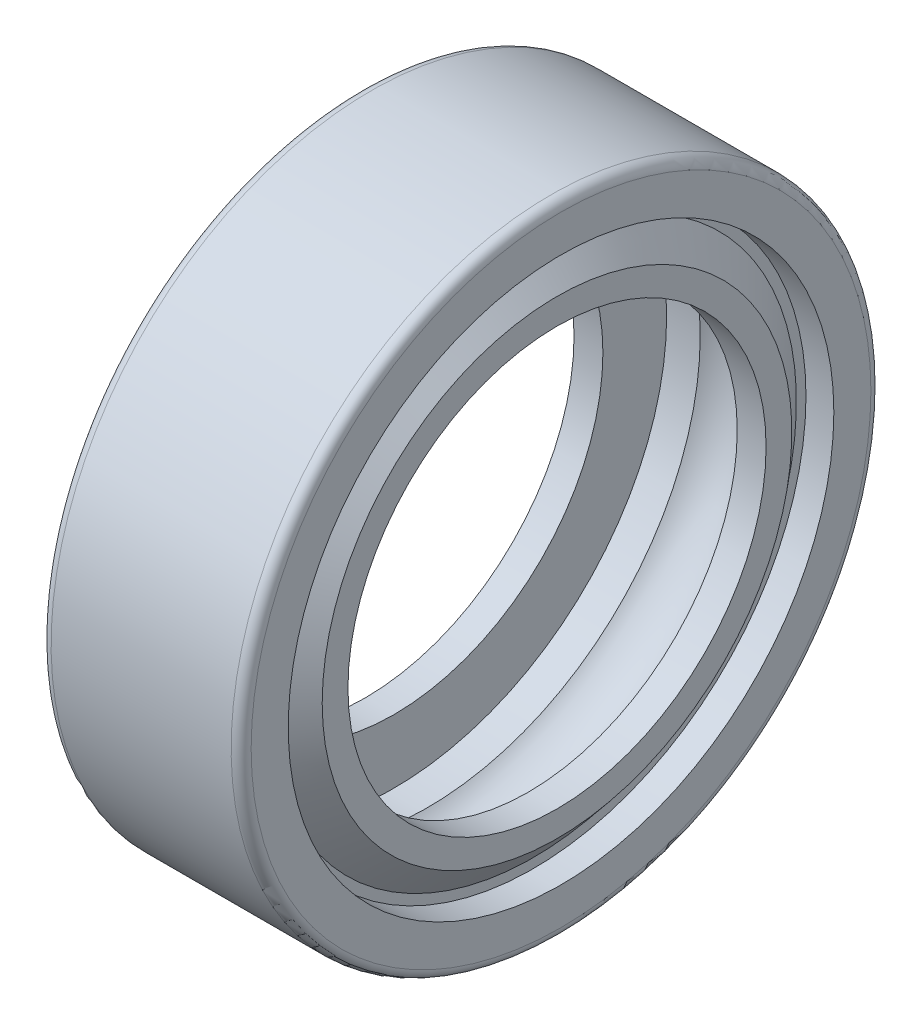
ISO-10303-21;
HEADER;
FILE_DESCRIPTION(('STEP AP214'),'2;1');
FILE_NAME('part.step','',(''),(''),'','','');
FILE_SCHEMA(('AUTOMOTIVE_DESIGN { 1 0 10303 214 1 1 1 1 }'));
ENDSEC;
DATA;
#1=APPLICATION_CONTEXT('core data for automotive mechanical design processes');
#2=APPLICATION_PROTOCOL_DEFINITION('international standard','automotive_design',2000,#1);
#3=PRODUCT_CONTEXT('',#1,'mechanical');
#4=PRODUCT('Part','Part','',(#3));
#5=PRODUCT_RELATED_PRODUCT_CATEGORY('part','',(#4));
#6=PRODUCT_DEFINITION_FORMATION('','',#4);
#7=PRODUCT_DEFINITION_CONTEXT('part definition',#1,'design');
#8=PRODUCT_DEFINITION('design','',#6,#7);
#9=PRODUCT_DEFINITION_SHAPE('','',#8);
#10=(LENGTH_UNIT() NAMED_UNIT(*) SI_UNIT(.MILLI.,.METRE.));
#11=(NAMED_UNIT(*) PLANE_ANGLE_UNIT() SI_UNIT($,.RADIAN.));
#12=(NAMED_UNIT(*) SI_UNIT($,.STERADIAN.) SOLID_ANGLE_UNIT());
#13=UNCERTAINTY_MEASURE_WITH_UNIT(LENGTH_MEASURE(1.E-05),#10,'distance_accuracy_value','');
#14=(GEOMETRIC_REPRESENTATION_CONTEXT(3) GLOBAL_UNCERTAINTY_ASSIGNED_CONTEXT((#13)) GLOBAL_UNIT_ASSIGNED_CONTEXT((#10,
#11,#12)) REPRESENTATION_CONTEXT('',''));
#15=CARTESIAN_POINT('',(0.,0.,0.));
#16=DIRECTION('',(0.,0.,1.));
#17=DIRECTION('',(1.,0.,0.));
#18=AXIS2_PLACEMENT_3D('',#15,#16,#17);
#19=CARTESIAN_POINT('',(0.,0.,0.));
#20=DIRECTION('',(1.,0.,0.));
#21=DIRECTION('',(0.,-1.,0.));
#22=AXIS2_PLACEMENT_3D('',#19,#20,#21);
#23=TOROIDAL_SURFACE('',#22,6.00075,1.175893);
#24=CARTESIAN_POINT('',(-0.839755569912454,0.,0.));
#25=DIRECTION('',(1.,0.,0.));
#26=DIRECTION('',(0.,0.,-1.));
#27=AXIS2_PLACEMENT_3D('',#24,#25,#26);
#28=CIRCLE('',#27,6.8238751);
#29=CARTESIAN_POINT('',(-0.839755569912454,0.,-6.8238751));
#30=VERTEX_POINT('',#29);
#31=EDGE_CURVE('E317',#30,#30,#28,.F.);
#32=ORIENTED_EDGE('',*,*,#31,.T.);
#33=EDGE_LOOP('',(#32));
#34=FACE_BOUND('',#33,.T.);
#35=CARTESIAN_POINT('',(0.839755569912453,0.,0.));
#36=DIRECTION('',(1.,0.,0.));
#37=DIRECTION('',(0.,0.,-1.));
#38=AXIS2_PLACEMENT_3D('',#35,#36,#37);
#39=CIRCLE('',#38,6.8238751);
#40=CARTESIAN_POINT('',(0.839755569912453,0.,-6.8238751));
#41=VERTEX_POINT('',#40);
#42=EDGE_CURVE('E320',#41,#41,#39,.T.);
#43=ORIENTED_EDGE('',*,*,#42,.T.);
#44=EDGE_LOOP('',(#43));
#45=FACE_BOUND('',#44,.T.);
#46=ADVANCED_FACE('F16',(#34,#45),#23,.F.);
#47=CARTESIAN_POINT('',(-2.75209,0.,0.));
#48=DIRECTION('',(1.,0.,0.));
#49=DIRECTION('',(0.,0.,-1.));
#50=AXIS2_PLACEMENT_3D('',#47,#48,#49);
#51=CYLINDRICAL_SURFACE('',#50,6.8238751);
#52=ORIENTED_EDGE('',*,*,#42,.F.);
#53=EDGE_LOOP('',(#52));
#54=FACE_BOUND('',#53,.T.);
#55=CARTESIAN_POINT('',(1.67997454728306,0.,0.));
#56=DIRECTION('',(1.,0.,0.));
#57=DIRECTION('',(0.,0.,-1.));
#58=AXIS2_PLACEMENT_3D('',#55,#56,#57);
#59=CIRCLE('',#58,6.8238751);
#60=CARTESIAN_POINT('',(1.67997454728306,0.,-6.8238751));
#61=VERTEX_POINT('',#60);
#62=EDGE_CURVE('E322',#61,#61,#59,.T.);
#63=ORIENTED_EDGE('',*,*,#62,.T.);
#64=EDGE_LOOP('',(#63));
#65=FACE_BOUND('',#64,.T.);
#66=ADVANCED_FACE('F291',(#54,#65),#51,.F.);
#67=CARTESIAN_POINT('',(-2.75209,0.,0.));
#68=DIRECTION('',(1.,0.,0.));
#69=DIRECTION('',(0.,0.,-1.));
#70=AXIS2_PLACEMENT_3D('',#67,#68,#69);
#71=CYLINDRICAL_SURFACE('',#70,6.8238751);
#72=ORIENTED_EDGE('',*,*,#31,.F.);
#73=EDGE_LOOP('',(#72));
#74=FACE_BOUND('',#73,.T.);
#75=CARTESIAN_POINT('',(-1.67997454728306,0.,0.));
#76=DIRECTION('',(1.,0.,0.));
#77=DIRECTION('',(0.,0.,-1.));
#78=AXIS2_PLACEMENT_3D('',#75,#76,#77);
#79=CIRCLE('',#78,6.8238751);
#80=CARTESIAN_POINT('',(-1.67997454728306,0.,-6.8238751));
#81=VERTEX_POINT('',#80);
#82=EDGE_CURVE('E362',#81,#81,#79,.T.);
#83=ORIENTED_EDGE('',*,*,#82,.F.);
#84=EDGE_LOOP('',(#83));
#85=FACE_BOUND('',#84,.T.);
#86=ADVANCED_FACE('F281',(#74,#85),#71,.F.);
#87=CARTESIAN_POINT('',(1.67997454728306,0.,0.));
#88=DIRECTION('',(1.,0.,0.));
#89=DIRECTION('',(0.,0.,-1.));
#90=AXIS2_PLACEMENT_3D('',#87,#88,#89);
#91=PLANE('',#90);
#92=ORIENTED_EDGE('',*,*,#62,.F.);
#93=EDGE_LOOP('',(#92));
#94=FACE_BOUND('',#93,.T.);
#95=CARTESIAN_POINT('',(1.67997454728306,0.,0.));
#96=DIRECTION('',(1.,0.,0.));
#97=DIRECTION('',(0.,0.,-1.));
#98=AXIS2_PLACEMENT_3D('',#95,#96,#97);
#99=CIRCLE('',#98,5.229401149);
#100=CARTESIAN_POINT('',(1.67997454728306,0.,-5.229401149));
#101=VERTEX_POINT('',#100);
#102=EDGE_CURVE('E359',#101,#101,#99,.T.);
#103=ORIENTED_EDGE('',*,*,#102,.T.);
#104=EDGE_LOOP('',(#103));
#105=FACE_BOUND('',#104,.T.);
#106=ADVANCED_FACE('F271',(#94,#105),#91,.F.);
#107=CARTESIAN_POINT('',(-1.67997454728306,0.,0.));
#108=DIRECTION('',(1.,0.,0.));
#109=DIRECTION('',(0.,0.,-1.));
#110=AXIS2_PLACEMENT_3D('',#107,#108,#109);
#111=PLANE('',#110);
#112=ORIENTED_EDGE('',*,*,#82,.T.);
#113=EDGE_LOOP('',(#112));
#114=FACE_BOUND('',#113,.T.);
#115=CARTESIAN_POINT('',(-1.67997454728306,0.,0.));
#116=DIRECTION('',(1.,0.,0.));
#117=DIRECTION('',(0.,0.,-1.));
#118=AXIS2_PLACEMENT_3D('',#115,#116,#117);
#119=CIRCLE('',#118,5.229401149);
#120=CARTESIAN_POINT('',(-1.67997454728306,0.,-5.229401149));
#121=VERTEX_POINT('',#120);
#122=EDGE_CURVE('E356',#121,#121,#119,.F.);
#123=ORIENTED_EDGE('',*,*,#122,.T.);
#124=EDGE_LOOP('',(#123));
#125=FACE_BOUND('',#124,.T.);
#126=ADVANCED_FACE('F261',(#114,#125),#111,.T.);
#127=CARTESIAN_POINT('',(-2.6420064,0.,0.));
#128=DIRECTION('',(1.,0.,0.));
#129=DIRECTION('',(0.,0.,-1.));
#130=AXIS2_PLACEMENT_3D('',#127,#128,#129);
#131=CYLINDRICAL_SURFACE('',#130,5.229401149);
#132=CARTESIAN_POINT('',(2.401824,0.,0.));
#133=DIRECTION('',(1.,0.,0.));
#134=DIRECTION('',(0.,0.,-1.));
#135=AXIS2_PLACEMENT_3D('',#132,#133,#134);
#136=CIRCLE('',#135,5.229401149);
#137=CARTESIAN_POINT('',(2.401824,0.,-5.229401149));
#138=VERTEX_POINT('',#137);
#139=EDGE_CURVE('E353',#138,#138,#136,.F.);
#140=ORIENTED_EDGE('',*,*,#139,.F.);
#141=EDGE_LOOP('',(#140));
#142=FACE_BOUND('',#141,.T.);
#143=ORIENTED_EDGE('',*,*,#102,.F.);
#144=EDGE_LOOP('',(#143));
#145=FACE_BOUND('',#144,.T.);
#146=ADVANCED_FACE('F251',(#142,#145),#131,.F.);
#147=CARTESIAN_POINT('',(-2.6420064,0.,0.));
#148=DIRECTION('',(1.,0.,0.));
#149=DIRECTION('',(0.,0.,-1.));
#150=AXIS2_PLACEMENT_3D('',#147,#148,#149);
#151=CYLINDRICAL_SURFACE('',#150,5.229401149);
#152=ORIENTED_EDGE('',*,*,#122,.F.);
#153=EDGE_LOOP('',(#152));
#154=FACE_BOUND('',#153,.T.);
#155=CARTESIAN_POINT('',(-2.401824,0.,0.));
#156=DIRECTION('',(1.,0.,0.));
#157=DIRECTION('',(0.,0.,-1.));
#158=AXIS2_PLACEMENT_3D('',#155,#156,#157);
#159=CIRCLE('',#158,5.229401149);
#160=CARTESIAN_POINT('',(-2.401824,0.,-5.229401149));
#161=VERTEX_POINT('',#160);
#162=EDGE_CURVE('E350',#161,#161,#159,.F.);
#163=ORIENTED_EDGE('',*,*,#162,.T.);
#164=EDGE_LOOP('',(#163));
#165=FACE_BOUND('',#164,.T.);
#166=ADVANCED_FACE('F241',(#154,#165),#151,.F.);
#167=CARTESIAN_POINT('',(2.401824,0.,0.));
#168=DIRECTION('',(1.,0.,0.));
#169=DIRECTION('',(0.,0.,-1.));
#170=AXIS2_PLACEMENT_3D('',#167,#168,#169);
#171=PLANE('',#170);
#172=CARTESIAN_POINT('',(2.40182399991697,0.,0.));
#173=DIRECTION('',(-1.,0.,0.));
#174=DIRECTION('',(0.,0.,1.));
#175=AXIS2_PLACEMENT_3D('',#172,#173,#174);
#176=CIRCLE('',#175,5.87385520856287);
#177=CARTESIAN_POINT('',(2.40182399991697,0.,5.87385520856287));
#178=VERTEX_POINT('',#177);
#179=EDGE_CURVE('E347',#178,#178,#176,.T.);
#180=ORIENTED_EDGE('',*,*,#179,.F.);
#181=EDGE_LOOP('',(#180));
#182=FACE_BOUND('',#181,.T.);
#183=ORIENTED_EDGE('',*,*,#139,.T.);
#184=EDGE_LOOP('',(#183));
#185=FACE_BOUND('',#184,.T.);
#186=ADVANCED_FACE('F230',(#182,#185),#171,.T.);
#187=CARTESIAN_POINT('',(-2.401824,0.,0.));
#188=DIRECTION('',(1.,0.,0.));
#189=DIRECTION('',(0.,0.,-1.));
#190=AXIS2_PLACEMENT_3D('',#187,#188,#189);
#191=PLANE('',#190);
#192=CARTESIAN_POINT('',(-2.40182399991697,0.,0.));
#193=DIRECTION('',(1.,0.,0.));
#194=DIRECTION('',(0.,0.,-1.));
#195=AXIS2_PLACEMENT_3D('',#192,#193,#194);
#196=CIRCLE('',#195,5.87385520856287);
#197=CARTESIAN_POINT('',(-2.40182399991697,0.,-5.87385520856287));
#198=VERTEX_POINT('',#197);
#199=EDGE_CURVE('E344',#198,#198,#196,.T.);
#200=ORIENTED_EDGE('',*,*,#199,.F.);
#201=EDGE_LOOP('',(#200));
#202=FACE_BOUND('',#201,.T.);
#203=ORIENTED_EDGE('',*,*,#162,.F.);
#204=EDGE_LOOP('',(#203));
#205=FACE_BOUND('',#204,.T.);
#206=ADVANCED_FACE('F219',(#202,#205),#191,.F.);
#207=CARTESIAN_POINT('',(1.80506954740167,0.,0.));
#208=DIRECTION('',(-1.,0.,0.));
#209=DIRECTION('',(0.,0.,1.));
#210=AXIS2_PLACEMENT_3D('',#207,#208,#209);
#211=CONICAL_SURFACE('',#210,6.585039471247,0.872664625998849);
#212=CARTESIAN_POINT('',(1.80506954721088,0.,0.));
#213=DIRECTION('',(-1.,0.,0.));
#214=DIRECTION('',(0.,0.,1.));
#215=AXIS2_PLACEMENT_3D('',#212,#213,#214);
#216=CIRCLE('',#215,6.58503947147437);
#217=CARTESIAN_POINT('',(1.80506954721088,0.,6.58503947147437));
#218=VERTEX_POINT('',#217);
#219=EDGE_CURVE('E341',#218,#218,#216,.T.);
#220=ORIENTED_EDGE('',*,*,#219,.F.);
#221=EDGE_LOOP('',(#220));
#222=FACE_BOUND('',#221,.T.);
#223=ORIENTED_EDGE('',*,*,#179,.T.);
#224=EDGE_LOOP('',(#223));
#225=FACE_BOUND('',#224,.T.);
#226=ADVANCED_FACE('F208',(#222,#225),#211,.T.);
#227=CARTESIAN_POINT('',(-1.80506954740167,0.,0.));
#228=DIRECTION('',(1.,0.,0.));
#229=DIRECTION('',(0.,0.,-1.));
#230=AXIS2_PLACEMENT_3D('',#227,#228,#229);
#231=CONICAL_SURFACE('',#230,6.585039471247,0.872664625998849);
#232=ORIENTED_EDGE('',*,*,#199,.T.);
#233=EDGE_LOOP('',(#232));
#234=FACE_BOUND('',#233,.T.);
#235=CARTESIAN_POINT('',(-1.80506954721088,0.,0.));
#236=DIRECTION('',(1.,0.,0.));
#237=DIRECTION('',(0.,0.,-1.));
#238=AXIS2_PLACEMENT_3D('',#235,#236,#237);
#239=CIRCLE('',#238,6.58503947147437);
#240=CARTESIAN_POINT('',(-1.80506954721088,0.,-6.58503947147437));
#241=VERTEX_POINT('',#240);
#242=EDGE_CURVE('E338',#241,#241,#239,.F.);
#243=ORIENTED_EDGE('',*,*,#242,.T.);
#244=EDGE_LOOP('',(#243));
#245=FACE_BOUND('',#244,.T.);
#246=ADVANCED_FACE('F197',(#234,#245),#231,.T.);
#247=CARTESIAN_POINT('',(1.80506954728306,0.,0.));
#248=DIRECTION('',(1.,0.,0.));
#249=DIRECTION('',(0.,0.,-1.));
#250=AXIS2_PLACEMENT_3D('',#247,#248,#249);
#251=PLANE('',#250);
#252=CARTESIAN_POINT('',(1.80506954728306,0.,0.));
#253=DIRECTION('',(1.,0.,0.));
#254=DIRECTION('',(0.,0.,-1.));
#255=AXIS2_PLACEMENT_3D('',#252,#253,#254);
#256=CIRCLE('',#255,6.8238751);
#257=CARTESIAN_POINT('',(1.80506954728306,0.,-6.8238751));
#258=VERTEX_POINT('',#257);
#259=EDGE_CURVE('E335',#258,#258,#256,.T.);
#260=ORIENTED_EDGE('',*,*,#259,.T.);
#261=EDGE_LOOP('',(#260));
#262=FACE_BOUND('',#261,.T.);
#263=ORIENTED_EDGE('',*,*,#219,.T.);
#264=EDGE_LOOP('',(#263));
#265=FACE_BOUND('',#264,.T.);
#266=ADVANCED_FACE('F185',(#262,#265),#251,.T.);
#267=CARTESIAN_POINT('',(-1.80506954728306,0.,0.));
#268=DIRECTION('',(1.,0.,0.));
#269=DIRECTION('',(0.,0.,-1.));
#270=AXIS2_PLACEMENT_3D('',#267,#268,#269);
#271=PLANE('',#270);
#272=CARTESIAN_POINT('',(-1.80506954728306,0.,0.));
#273=DIRECTION('',(1.,0.,0.));
#274=DIRECTION('',(0.,0.,-1.));
#275=AXIS2_PLACEMENT_3D('',#272,#273,#274);
#276=CIRCLE('',#275,6.8238751);
#277=CARTESIAN_POINT('',(-1.80506954728306,0.,-6.8238751));
#278=VERTEX_POINT('',#277);
#279=EDGE_CURVE('E332',#278,#278,#276,.F.);
#280=ORIENTED_EDGE('',*,*,#279,.T.);
#281=EDGE_LOOP('',(#280));
#282=FACE_BOUND('',#281,.T.);
#283=ORIENTED_EDGE('',*,*,#242,.F.);
#284=EDGE_LOOP('',(#283));
#285=FACE_BOUND('',#284,.T.);
#286=ADVANCED_FACE('F174',(#282,#285),#271,.F.);
#287=CARTESIAN_POINT('',(-2.75209,0.,0.));
#288=DIRECTION('',(1.,0.,0.));
#289=DIRECTION('',(0.,0.,-1.));
#290=AXIS2_PLACEMENT_3D('',#287,#288,#289);
#291=CYLINDRICAL_SURFACE('',#290,6.8238751);
#292=CARTESIAN_POINT('',(2.5019,0.,0.));
#293=DIRECTION('',(1.,0.,0.));
#294=DIRECTION('',(0.,0.,-1.));
#295=AXIS2_PLACEMENT_3D('',#292,#293,#294);
#296=CIRCLE('',#295,6.8238751);
#297=CARTESIAN_POINT('',(2.5019,0.,-6.8238751));
#298=VERTEX_POINT('',#297);
#299=EDGE_CURVE('E329',#298,#298,#296,.F.);
#300=ORIENTED_EDGE('',*,*,#299,.F.);
#301=EDGE_LOOP('',(#300));
#302=FACE_BOUND('',#301,.T.);
#303=ORIENTED_EDGE('',*,*,#259,.F.);
#304=EDGE_LOOP('',(#303));
#305=FACE_BOUND('',#304,.T.);
#306=ADVANCED_FACE('F165',(#302,#305),#291,.F.);
#307=CARTESIAN_POINT('',(-2.75209,0.,0.));
#308=DIRECTION('',(1.,0.,0.));
#309=DIRECTION('',(0.,0.,-1.));
#310=AXIS2_PLACEMENT_3D('',#307,#308,#309);
#311=CYLINDRICAL_SURFACE('',#310,6.8238751);
#312=CARTESIAN_POINT('',(-2.5019,0.,0.));
#313=DIRECTION('',(1.,0.,0.));
#314=DIRECTION('',(0.,0.,-1.));
#315=AXIS2_PLACEMENT_3D('',#312,#313,#314);
#316=CIRCLE('',#315,6.8238751);
#317=CARTESIAN_POINT('',(-2.5019,0.,-6.8238751));
#318=VERTEX_POINT('',#317);
#319=EDGE_CURVE('E326',#318,#318,#316,.F.);
#320=ORIENTED_EDGE('',*,*,#319,.T.);
#321=EDGE_LOOP('',(#320));
#322=FACE_BOUND('',#321,.T.);
#323=ORIENTED_EDGE('',*,*,#279,.F.);
#324=EDGE_LOOP('',(#323));
#325=FACE_BOUND('',#324,.T.);
#326=ADVANCED_FACE('F157',(#322,#325),#311,.F.);
#327=CARTESIAN_POINT('',(2.5019,0.,0.));
#328=DIRECTION('',(1.,0.,0.));
#329=DIRECTION('',(0.,0.,-1.));
#330=AXIS2_PLACEMENT_3D('',#327,#328,#329);
#331=PLANE('',#330);
#332=CARTESIAN_POINT('',(2.5019,0.,0.));
#333=DIRECTION('',(-1.,0.,0.));
#334=DIRECTION('',(0.,1.,0.));
#335=AXIS2_PLACEMENT_3D('',#332,#333,#334);
#336=CIRCLE('',#335,7.75081);
#337=CARTESIAN_POINT('',(2.5019,7.75081,0.));
#338=VERTEX_POINT('',#337);
#339=CARTESIAN_POINT('',(2.5019,-7.75081,0.));
#340=VERTEX_POINT('',#339);
#341=EDGE_CURVE('E47',#338,#340,#336,.T.);
#342=ORIENTED_EDGE('',*,*,#341,.F.);
#343=CARTESIAN_POINT('',(2.5019,0.,0.));
#344=DIRECTION('',(-1.,0.,0.));
#345=DIRECTION('',(0.,-1.,0.));
#346=AXIS2_PLACEMENT_3D('',#343,#344,#345);
#347=CIRCLE('',#346,7.75081);
#348=EDGE_CURVE('E52',#340,#338,#347,.T.);
#349=ORIENTED_EDGE('',*,*,#348,.F.);
#350=EDGE_LOOP('',(#342,#349));
#351=FACE_BOUND('',#350,.T.);
#352=ORIENTED_EDGE('',*,*,#299,.T.);
#353=EDGE_LOOP('',(#352));
#354=FACE_BOUND('',#353,.T.);
#355=ADVANCED_FACE('F50',(#351,#354),#331,.T.);
#356=CARTESIAN_POINT('',(-2.5019,0.,0.));
#357=DIRECTION('',(1.,0.,0.));
#358=DIRECTION('',(0.,0.,-1.));
#359=AXIS2_PLACEMENT_3D('',#356,#357,#358);
#360=PLANE('',#359);
#361=CARTESIAN_POINT('',(-2.5019,0.,0.));
#362=DIRECTION('',(1.,0.,0.));
#363=DIRECTION('',(0.,-1.,0.));
#364=AXIS2_PLACEMENT_3D('',#361,#362,#363);
#365=CIRCLE('',#364,7.75081);
#366=CARTESIAN_POINT('',(-2.5019,-7.75081,0.));
#367=VERTEX_POINT('',#366);
#368=CARTESIAN_POINT('',(-2.5019,7.75081,0.));
#369=VERTEX_POINT('',#368);
#370=EDGE_CURVE('E56',#367,#369,#365,.T.);
#371=ORIENTED_EDGE('',*,*,#370,.F.);
#372=CARTESIAN_POINT('',(-2.5019,0.,0.));
#373=DIRECTION('',(1.,0.,0.));
#374=DIRECTION('',(0.,1.,0.));
#375=AXIS2_PLACEMENT_3D('',#372,#373,#374);
#376=CIRCLE('',#375,7.75081);
#377=EDGE_CURVE('E34',#369,#367,#376,.T.);
#378=ORIENTED_EDGE('',*,*,#377,.F.);
#379=EDGE_LOOP('',(#371,#378));
#380=FACE_BOUND('',#379,.T.);
#381=ORIENTED_EDGE('',*,*,#319,.F.);
#382=EDGE_LOOP('',(#381));
#383=FACE_BOUND('',#382,.T.);
#384=ADVANCED_FACE('F88',(#380,#383),#360,.F.);
#385=CARTESIAN_POINT('',(2.25171,0.,0.));
#386=DIRECTION('',(1.,0.,0.));
#387=DIRECTION('',(0.,-1.,0.));
#388=AXIS2_PLACEMENT_3D('',#385,#386,#387);
#389=TOROIDAL_SURFACE('',#388,7.75081,0.25019);
#390=CARTESIAN_POINT('',(2.25171,0.,0.));
#391=DIRECTION('',(1.,0.,0.));
#392=DIRECTION('',(0.,0.,-1.));
#393=AXIS2_PLACEMENT_3D('',#390,#391,#392);
#394=CIRCLE('',#393,8.001);
#395=CARTESIAN_POINT('',(2.25171,0.,-8.001));
#396=VERTEX_POINT('',#395);
#397=EDGE_CURVE('E27',#396,#396,#394,.F.);
#398=ORIENTED_EDGE('',*,*,#397,.F.);
#399=EDGE_LOOP('',(#398));
#400=FACE_BOUND('',#399,.T.);
#401=ORIENTED_EDGE('',*,*,#341,.T.);
#402=ORIENTED_EDGE('',*,*,#348,.T.);
#403=EDGE_LOOP('',(#401,#402));
#404=FACE_BOUND('',#403,.T.);
#405=ADVANCED_FACE('F58',(#400,#404),#389,.T.);
#406=CARTESIAN_POINT('',(-2.25171,0.,0.));
#407=DIRECTION('',(1.,0.,0.));
#408=DIRECTION('',(0.,-1.,0.));
#409=AXIS2_PLACEMENT_3D('',#406,#407,#408);
#410=TOROIDAL_SURFACE('',#409,7.75081,0.25019);
#411=ORIENTED_EDGE('',*,*,#377,.T.);
#412=ORIENTED_EDGE('',*,*,#370,.T.);
#413=EDGE_LOOP('',(#411,#412));
#414=FACE_BOUND('',#413,.T.);
#415=CARTESIAN_POINT('',(-2.25171,0.,0.));
#416=DIRECTION('',(1.,0.,0.));
#417=DIRECTION('',(0.,0.,-1.));
#418=AXIS2_PLACEMENT_3D('',#415,#416,#417);
#419=CIRCLE('',#418,8.001);
#420=CARTESIAN_POINT('',(-2.25171,0.,-8.001));
#421=VERTEX_POINT('',#420);
#422=EDGE_CURVE('E10',#421,#421,#419,.T.);
#423=ORIENTED_EDGE('',*,*,#422,.F.);
#424=EDGE_LOOP('',(#423));
#425=FACE_BOUND('',#424,.T.);
#426=ADVANCED_FACE('F64',(#414,#425),#410,.T.);
#427=CARTESIAN_POINT('',(-2.75209,0.,0.));
#428=DIRECTION('',(1.,0.,0.));
#429=DIRECTION('',(0.,0.,-1.));
#430=AXIS2_PLACEMENT_3D('',#427,#428,#429);
#431=CYLINDRICAL_SURFACE('',#430,8.001);
#432=ORIENTED_EDGE('',*,*,#422,.T.);
#433=EDGE_LOOP('',(#432));
#434=FACE_BOUND('',#433,.T.);
#435=ORIENTED_EDGE('',*,*,#397,.T.);
#436=EDGE_LOOP('',(#435));
#437=FACE_BOUND('',#436,.T.);
#438=ADVANCED_FACE('F74',(#434,#437),#431,.T.);
#439=CLOSED_SHELL('',(#46,#66,#86,#106,#126,#146,#166,#186,#206,#226,#246,#266,#286,#306,#326,
#355,#384,#405,#426,#438));
#440=MANIFOLD_SOLID_BREP('B1',#439);
#441=ADVANCED_BREP_SHAPE_REPRESENTATION('',(#18,#440),#14);
#442=SHAPE_DEFINITION_REPRESENTATION(#9,#441);
ENDSEC;
END-ISO-10303-21;
